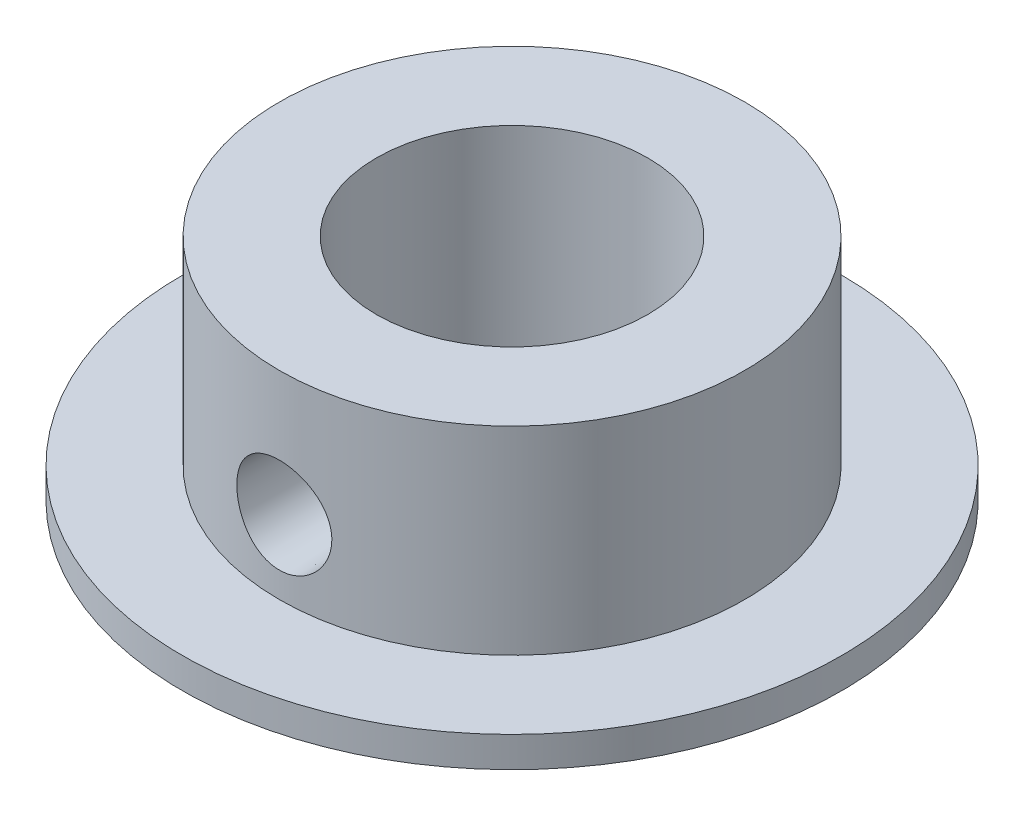
ISO-10303-21;
HEADER;
FILE_DESCRIPTION(('STEP AP214'),'2;1');
FILE_NAME('part.step','',(''),(''),'','','');
FILE_SCHEMA(('AUTOMOTIVE_DESIGN { 1 0 10303 214 1 1 1 1 }'));
ENDSEC;
DATA;
#1=APPLICATION_CONTEXT('core data for automotive mechanical design processes');
#2=APPLICATION_PROTOCOL_DEFINITION('international standard','automotive_design',2000,#1);
#3=PRODUCT_CONTEXT('',#1,'mechanical');
#4=PRODUCT('Part','Part','',(#3));
#5=PRODUCT_RELATED_PRODUCT_CATEGORY('part','',(#4));
#6=PRODUCT_DEFINITION_FORMATION('','',#4);
#7=PRODUCT_DEFINITION_CONTEXT('part definition',#1,'design');
#8=PRODUCT_DEFINITION('design','',#6,#7);
#9=PRODUCT_DEFINITION_SHAPE('','',#8);
#10=(LENGTH_UNIT() NAMED_UNIT(*) SI_UNIT(.MILLI.,.METRE.));
#11=(NAMED_UNIT(*) PLANE_ANGLE_UNIT() SI_UNIT($,.RADIAN.));
#12=(NAMED_UNIT(*) SI_UNIT($,.STERADIAN.) SOLID_ANGLE_UNIT());
#13=UNCERTAINTY_MEASURE_WITH_UNIT(LENGTH_MEASURE(1.E-05),#10,'distance_accuracy_value','');
#14=(GEOMETRIC_REPRESENTATION_CONTEXT(3) GLOBAL_UNCERTAINTY_ASSIGNED_CONTEXT((#13)) GLOBAL_UNIT_ASSIGNED_CONTEXT((#10,
#11,#12)) REPRESENTATION_CONTEXT('',''));
#15=CARTESIAN_POINT('',(0.,0.,0.));
#16=DIRECTION('',(0.,0.,1.));
#17=DIRECTION('',(1.,0.,0.));
#18=AXIS2_PLACEMENT_3D('',#15,#16,#17);
#19=CARTESIAN_POINT('',(-43.18,0.,0.));
#20=DIRECTION('',(0.,1.,0.));
#21=DIRECTION('',(0.,0.,1.));
#22=AXIS2_PLACEMENT_3D('',#19,#20,#21);
#23=PLANE('',#22);
#24=CARTESIAN_POINT('',(0.,0.,0.));
#25=DIRECTION('',(0.,-1.,0.));
#26=DIRECTION('',(0.,0.,-1.));
#27=AXIS2_PLACEMENT_3D('',#24,#25,#26);
#28=CIRCLE('',#27,17.78);
#29=CARTESIAN_POINT('',(0.,0.,-17.78));
#30=VERTEX_POINT('',#29);
#31=EDGE_CURVE('E49',#30,#30,#28,.T.);
#32=ORIENTED_EDGE('',*,*,#31,.F.);
#33=EDGE_LOOP('',(#32));
#34=FACE_BOUND('',#33,.T.);
#35=CARTESIAN_POINT('',(0.,0.,0.));
#36=DIRECTION('',(0.,-1.,0.));
#37=DIRECTION('',(0.,0.,-1.));
#38=AXIS2_PLACEMENT_3D('',#35,#36,#37);
#39=CIRCLE('',#38,43.18);
#40=CARTESIAN_POINT('',(0.,0.,-43.18));
#41=VERTEX_POINT('',#40);
#42=EDGE_CURVE('E68',#41,#41,#39,.T.);
#43=ORIENTED_EDGE('',*,*,#42,.T.);
#44=EDGE_LOOP('',(#43));
#45=FACE_BOUND('',#44,.T.);
#46=ADVANCED_FACE('F38',(#34,#45),#23,.F.);
#47=CARTESIAN_POINT('',(0.,0.,0.));
#48=DIRECTION('',(0.,-1.,0.));
#49=DIRECTION('',(0.,0.,-1.));
#50=AXIS2_PLACEMENT_3D('',#47,#48,#49);
#51=CYLINDRICAL_SURFACE('',#50,17.78);
#52=CARTESIAN_POINT('',(5.5626,13.5907211335726,16.8874474459582));
#53=CARTESIAN_POINT('',(5.56259799653194,13.8948516181382,16.887449279834));
#54=CARTESIAN_POINT('',(5.53757320653063,14.1990025148895,16.8957530810345));
#55=CARTESIAN_POINT('',(5.43842248054542,14.7983675438744,16.9279238130886));
#56=CARTESIAN_POINT('',(5.36428336511177,15.0935792551055,16.951794921282));
#57=CARTESIAN_POINT('',(5.16970366647505,15.6662973683474,17.0121376775781));
#58=CARTESIAN_POINT('',(5.04934515949177,15.9438341446535,17.0485869778099));
#59=CARTESIAN_POINT('',(4.76601718609229,16.4748533031106,17.1299481285032));
#60=CARTESIAN_POINT('',(4.60304015935641,16.7283314064844,17.1748614800512));
#61=CARTESIAN_POINT('',(4.23309199808434,17.2127655020356,17.2698245753533));
#62=CARTESIAN_POINT('',(4.02490617519083,17.4427712416914,17.3199909037924));
#63=CARTESIAN_POINT('',(3.57304914194704,17.8652416455484,17.4188155665127));
#64=CARTESIAN_POINT('',(3.32937297318863,18.0577010552927,17.4674736889262));
#65=CARTESIAN_POINT('',(2.80662170029229,18.4038108209972,17.5591333349199));
#66=CARTESIAN_POINT('',(2.52686923865835,18.5564822781229,17.6019815856354));
#67=CARTESIAN_POINT('',(1.94408899625521,18.8122367366045,17.6758320166248));
#68=CARTESIAN_POINT('',(1.641066718983,18.91533142163,17.7068369876287));
#69=CARTESIAN_POINT('',(1.03029836414449,19.0658322015901,17.7526822208269));
#70=CARTESIAN_POINT('',(0.722988466410091,19.1148624997284,17.7679929065144));
#71=CARTESIAN_POINT('',(0.104148158810804,19.1609891732897,17.7823860653401));
#72=CARTESIAN_POINT('',(-0.207381273357763,19.1580973804834,17.7814722356481));
#73=CARTESIAN_POINT('',(-0.814385038140694,19.1015297818226,17.7638467348304));
#74=CARTESIAN_POINT('',(-1.11004190701803,19.0496147463812,17.7476828195214));
#75=CARTESIAN_POINT('',(-1.68821414843808,18.8993638263056,17.7020472649873));
#76=CARTESIAN_POINT('',(-1.97072866194665,18.8010249119013,17.6725747572066));
#77=CARTESIAN_POINT('',(-2.51865568669428,18.559588100272,17.6028988935839));
#78=CARTESIAN_POINT('',(-2.78381616797672,18.4159564234788,17.5625684510842));
#79=CARTESIAN_POINT('',(-3.28681863173487,18.0884396778238,17.475425115714));
#80=CARTESIAN_POINT('',(-3.52465367063432,17.904544412059,17.4286105818287));
#81=CARTESIAN_POINT('',(-3.97675265174619,17.4926834744681,17.3311736146953));
#82=CARTESIAN_POINT('',(-4.18961727892208,17.2631979675597,17.2804738038556));
#83=CARTESIAN_POINT('',(-4.57425823479846,16.7713137594753,17.1826671732615));
#84=CARTESIAN_POINT('',(-4.74602970076193,16.5089111686689,17.135560779181));
#85=CARTESIAN_POINT('',(-5.04524152195174,15.9546797442947,17.0498836855244));
#86=CARTESIAN_POINT('',(-5.17216242207277,15.662553568771,17.0114147733903));
#87=CARTESIAN_POINT('',(-5.37457029510353,15.0595812987839,16.9485620949023));
#88=CARTESIAN_POINT('',(-5.45007579784475,14.7487419924369,16.9241732546493));
#89=CARTESIAN_POINT('',(-5.54480742208901,14.1305759767549,16.8933687285531));
#90=CARTESIAN_POINT('',(-5.56617677885104,13.8236115989619,16.8862690346161));
#91=CARTESIAN_POINT('',(-5.55804712196391,13.2104615595694,16.8889473614438));
#92=CARTESIAN_POINT('',(-5.52855599040939,12.9042757846705,16.8987227669933));
#93=CARTESIAN_POINT('',(-5.42145805901938,12.3106103574777,16.9333744324758));
#94=CARTESIAN_POINT('',(-5.34527160049011,12.022845726354,16.9578044883787));
#95=CARTESIAN_POINT('',(-5.14861388208657,11.4642166833903,17.0185397464918));
#96=CARTESIAN_POINT('',(-5.0281353885546,11.1933550405586,17.0548468883294));
#97=CARTESIAN_POINT('',(-4.74236365399869,10.6676083094957,17.1365403508849));
#98=CARTESIAN_POINT('',(-4.57588230062069,10.4134058246456,17.1821575534104));
#99=CARTESIAN_POINT('',(-4.20421700309147,9.93576513054903,17.2768536945692));
#100=CARTESIAN_POINT('',(-3.99902298217203,9.71233495747989,17.325933532427));
#101=CARTESIAN_POINT('',(-3.54561483414568,9.29300368254682,17.4244926641608));
#102=CARTESIAN_POINT('',(-3.29596739155893,9.09863228164299,17.4739038128939));
#103=CARTESIAN_POINT('',(-2.76640364247078,8.75448041968676,17.5655205183631));
#104=CARTESIAN_POINT('',(-2.48648871916527,8.60469792213575,17.607726404146));
#105=CARTESIAN_POINT('',(-1.90605469683529,8.3554115877011,17.67993671454));
#106=CARTESIAN_POINT('',(-1.60570323086148,8.25554421322612,17.7100290411099));
#107=CARTESIAN_POINT('',(-0.991359762528713,8.10807300016658,17.7550081633762));
#108=CARTESIAN_POINT('',(-0.677372071624576,8.06045276553649,17.7698997292292));
#109=CARTESIAN_POINT('',(-0.0587487764184504,8.02016193405157,17.7824826718043));
#110=CARTESIAN_POINT('',(0.245730566899102,8.02528197792518,17.780865641322));
#111=CARTESIAN_POINT('',(0.849294856623028,8.0849817447503,17.7622703954053));
#112=CARTESIAN_POINT('',(1.14838015480263,8.1395582304122,17.7452931854082));
#113=CARTESIAN_POINT('',(1.72897426833904,8.295213854852,17.6981045443233));
#114=CARTESIAN_POINT('',(2.01065666127446,8.39570031667859,17.6680620115536));
#115=CARTESIAN_POINT('',(2.55329892254731,8.63978785619013,17.5978409184935));
#116=CARTESIAN_POINT('',(2.81425522292724,8.78339633699422,17.5576606179567));
#117=CARTESIAN_POINT('',(3.31768437705666,9.11529346149104,17.4696571970187));
#118=CARTESIAN_POINT('',(3.55922813032537,9.30493425316835,17.4216208050681));
#119=CARTESIAN_POINT('',(4.00779737055767,9.7211294125474,17.3239361070312));
#120=CARTESIAN_POINT('',(4.21481248049181,9.94769483705322,17.2742873217026));
#121=CARTESIAN_POINT('',(4.59539039242137,10.4403313330796,17.1770402529991));
#122=CARTESIAN_POINT('',(4.76761301971548,10.7074649763758,17.129564927276));
#123=CARTESIAN_POINT('',(5.06453421944384,11.2683115528947,17.0441454442059));
#124=CARTESIAN_POINT('',(5.18925190485222,11.5620137376398,17.006197455762));
#125=CARTESIAN_POINT('',(5.37858260309395,12.1421205671121,16.9472198273331));
#126=CARTESIAN_POINT('',(5.4473860542798,12.4270424578128,16.9250309773609));
#127=CARTESIAN_POINT('',(5.53939006705727,13.0048782972278,16.8951456992054));
#128=CARTESIAN_POINT('',(5.5626019296904,13.2977902471454,16.8874456796148));
#129=CARTESIAN_POINT('',(5.5626,13.5907211335726,16.8874474459582));
#130=B_SPLINE_CURVE_WITH_KNOTS('',3,(#52,#53,#54,#55,#56,#57,#58,#59,#60,#61,#62,#63,#64,#65,
#66,#67,#68,#69,#70,#71,#72,#73,#74,#75,#76,#77,#78,#79,#80,#81,#82,#83,#84,#85,#86,#87,#88,#89,
#90,#91,#92,#93,#94,#95,#96,#97,#98,#99,#100,#101,#102,#103,#104,#105,#106,#107,#108,#109,#110,
#111,#112,#113,#114,#115,#116,#117,#118,#119,#120,#121,#122,#123,#124,#125,#126,#127,#128,#129),
.UNSPECIFIED.,.T.,.F.,(4,2,2,2,2,2,2,2,2,2,2,2,2,2,2,2,2,2,2,2,2,2,2,2,2,2,2,2,2,2,2,2,2,2,2,2,
2,2,4),(0.,0.911309336315475,1.82286331456051,2.732805988797,3.64291019210341,4.58142903624863,
5.5200791282382,6.48001211295374,7.43971876097127,8.36973424418313,9.29953780237007,
10.1971668451653,11.0948544781912,12.003543851136,12.9124636197677,13.8593446088505,
14.8063375912204,15.7639644034392,16.7212459092102,17.6399908505404,18.5585934223401,
19.4505531110074,20.3426585369258,21.260394838288,22.178370353521,23.1344904924302,
24.0905669559846,25.0395748671134,25.9882848780804,26.8974194311162,27.8064944788751,
28.7041516581378,29.6019630339425,30.5302751554279,31.458865765478,32.4183126864641,
33.377373178118,34.2553412232837,35.1330916141319),.UNSPECIFIED.);
#131=CARTESIAN_POINT('',(5.5626,13.5907211335726,16.8874474459582));
#132=VERTEX_POINT('',#131);
#133=EDGE_CURVE('E71',#132,#132,#130,.T.);
#134=ORIENTED_EDGE('',*,*,#133,.T.);
#135=EDGE_LOOP('',(#134));
#136=FACE_BOUND('',#135,.T.);
#137=CARTESIAN_POINT('',(0.,30.,0.));
#138=DIRECTION('',(0.,-1.,0.));
#139=DIRECTION('',(0.,0.,-1.));
#140=AXIS2_PLACEMENT_3D('',#137,#138,#139);
#141=CIRCLE('',#140,17.78);
#142=CARTESIAN_POINT('',(0.,30.,-17.78));
#143=VERTEX_POINT('',#142);
#144=EDGE_CURVE('E53',#143,#143,#141,.T.);
#145=ORIENTED_EDGE('',*,*,#144,.F.);
#146=EDGE_LOOP('',(#145));
#147=FACE_BOUND('',#146,.T.);
#148=ORIENTED_EDGE('',*,*,#31,.T.);
#149=EDGE_LOOP('',(#148));
#150=FACE_BOUND('',#149,.T.);
#151=ADVANCED_FACE('F104',(#136,#147,#150),#51,.F.);
#152=CARTESIAN_POINT('',(-17.78,30.,0.));
#153=DIRECTION('',(0.,-1.,0.));
#154=DIRECTION('',(0.,0.,-1.));
#155=AXIS2_PLACEMENT_3D('',#152,#153,#154);
#156=PLANE('',#155);
#157=CARTESIAN_POINT('',(0.,30.,0.));
#158=DIRECTION('',(0.,-1.,0.));
#159=DIRECTION('',(0.,0.,-1.));
#160=AXIS2_PLACEMENT_3D('',#157,#158,#159);
#161=CIRCLE('',#160,30.48);
#162=CARTESIAN_POINT('',(0.,30.,-30.48));
#163=VERTEX_POINT('',#162);
#164=EDGE_CURVE('E57',#163,#163,#161,.T.);
#165=ORIENTED_EDGE('',*,*,#164,.F.);
#166=EDGE_LOOP('',(#165));
#167=FACE_BOUND('',#166,.T.);
#168=ORIENTED_EDGE('',*,*,#144,.T.);
#169=EDGE_LOOP('',(#168));
#170=FACE_BOUND('',#169,.T.);
#171=ADVANCED_FACE('F109',(#167,#170),#156,.F.);
#172=CARTESIAN_POINT('',(0.,0.,0.));
#173=DIRECTION('',(0.,-1.,0.));
#174=DIRECTION('',(0.,0.,-1.));
#175=AXIS2_PLACEMENT_3D('',#172,#173,#174);
#176=CYLINDRICAL_SURFACE('',#175,30.48);
#177=CARTESIAN_POINT('',(-4.48000392389874,9.25603133846592,30.1489629148641));
#178=CARTESIAN_POINT('',(-4.72247113458441,9.50819389164376,30.1129338951547));
#179=CARTESIAN_POINT('',(-4.94379996884934,9.7809284912397,30.0770512021185));
#180=CARTESIAN_POINT('',(-5.33798949704485,10.3601304241621,30.0096062659273));
#181=CARTESIAN_POINT('',(-5.51081356925483,10.6666230033997,29.9780472963912));
#182=CARTESIAN_POINT('',(-5.8029464422564,11.3049767160678,29.9228745201749));
#183=CARTESIAN_POINT('',(-5.92223706797604,11.6368464205648,29.8992634125419));
#184=CARTESIAN_POINT('',(-6.10351454748918,12.3163826272242,29.8627889130605));
#185=CARTESIAN_POINT('',(-6.16551682605666,12.6640448508169,29.8499226282795));
#186=CARTESIAN_POINT('',(-6.22987573987205,13.3606862179332,29.8365569372631));
#187=CARTESIAN_POINT('',(-6.23296915148332,13.7095944236912,29.8359047701124));
#188=CARTESIAN_POINT('',(-6.18129381404148,14.4029061179806,29.8466527741398));
#189=CARTESIAN_POINT('',(-6.12652530003199,14.747309624805,29.8580528963597));
#190=CARTESIAN_POINT('',(-5.96145141776871,15.4193505357793,29.8914443447242));
#191=CARTESIAN_POINT('',(-5.85154537458516,15.7470900923186,29.9133594685269));
#192=CARTESIAN_POINT('',(-5.57965574578697,16.3795147213721,29.9652614327979));
#193=CARTESIAN_POINT('',(-5.41766754313323,16.684197746985,29.995248988842));
#194=CARTESIAN_POINT('',(-5.04353875024559,17.2664588939525,30.0604315611117));
#195=CARTESIAN_POINT('',(-4.83073487386508,17.5436033630238,30.0956929242731));
#196=CARTESIAN_POINT('',(-4.36198325557281,18.0585073960779,30.1671939416486));
#197=CARTESIAN_POINT('',(-4.10603181949941,18.2962635842981,30.2034336794049));
#198=CARTESIAN_POINT('',(-3.55451236143887,18.7284251881168,30.2733194586524));
#199=CARTESIAN_POINT('',(-3.25851282784303,18.9222864339178,30.3069298819289));
#200=CARTESIAN_POINT('',(-2.63740171350416,19.257298046809,30.367280387175));
#201=CARTESIAN_POINT('',(-2.31229239989166,19.3984525143939,30.394021003553));
#202=CARTESIAN_POINT('',(-1.64594515478295,19.6223632112039,30.4373358060864));
#203=CARTESIAN_POINT('',(-1.30492780648902,19.7057538134953,30.4540201588241));
#204=CARTESIAN_POINT('',(-0.613373739581415,19.813926528134,30.4757896161221));
#205=CARTESIAN_POINT('',(-0.262838308505033,19.8387165279887,30.4808762817014));
#206=CARTESIAN_POINT('',(0.430541652697676,19.8289710864849,30.4788933984586));
#207=CARTESIAN_POINT('',(0.773403507375742,19.7955767486483,30.4720576674102));
#208=CARTESIAN_POINT('',(1.44851341164854,19.672743525369,30.4474358072788));
#209=CARTESIAN_POINT('',(1.78076146476839,19.5833046585403,30.4296496818327));
#210=CARTESIAN_POINT('',(2.42544476915547,19.3511704394965,30.3850642378461));
#211=CARTESIAN_POINT('',(2.73787865234378,19.2084714145814,30.3582642977458));
#212=CARTESIAN_POINT('',(3.33463025710079,18.8740056233484,30.2985262174026));
#213=CARTESIAN_POINT('',(3.61894471227846,18.6822331658539,30.265587365334));
#214=CARTESIAN_POINT('',(4.15728640221199,18.250755982749,30.196399542017));
#215=CARTESIAN_POINT('',(4.41062218110615,18.0101966076357,30.160098905075));
#216=CARTESIAN_POINT('',(4.87375697978455,17.4901119760468,30.0887343090442));
#217=CARTESIAN_POINT('',(5.0835524276711,17.2105835258258,30.0536704516121));
#218=CARTESIAN_POINT('',(5.45605423907557,16.6165758431748,29.9883006951489));
#219=CARTESIAN_POINT('',(5.61818169118517,16.3017263609734,29.9580551836878));
#220=CARTESIAN_POINT('',(5.88722071244882,15.6485843949176,29.906352570051));
#221=CARTESIAN_POINT('',(5.99413730666365,15.3102940477322,29.8848946681008));
#222=CARTESIAN_POINT('',(6.1485446516712,14.6239142506757,29.8535090113337));
#223=CARTESIAN_POINT('',(6.19669365375662,14.275978846755,29.8434536299746));
#224=CARTESIAN_POINT('',(6.23421445475274,13.5768315880009,29.835639221645));
#225=CARTESIAN_POINT('',(6.22359161943182,13.2256200351969,29.8378790721407));
#226=CARTESIAN_POINT('',(6.14448949127621,12.5350707574578,29.8542659035522));
#227=CARTESIAN_POINT('',(6.07682102613925,12.195635680222,29.8682460018458));
#228=CARTESIAN_POINT('',(5.8867814671738,11.53304278612,29.9062788024832));
#229=CARTESIAN_POINT('',(5.7644075772491,11.2098858021969,29.9303320196791));
#230=CARTESIAN_POINT('',(5.46749246075758,10.5864342092598,29.9859931434248));
#231=CARTESIAN_POINT('',(5.29259278940083,10.2863150752651,30.0176526497225));
#232=CARTESIAN_POINT('',(4.895798142843,9.71942145465693,30.0849121062518));
#233=CARTESIAN_POINT('',(4.6738978992107,9.45265071149706,30.1205124980151));
#234=CARTESIAN_POINT('',(4.18501535116696,8.95549562227931,30.1923490452789));
#235=CARTESIAN_POINT('',(3.91735646828385,8.72577608389435,30.2285860953747));
#236=CARTESIAN_POINT('',(3.34678416336345,8.31455162790204,30.2970602119394));
#237=CARTESIAN_POINT('',(3.04387101091598,8.13304634163454,30.329297308992));
#238=CARTESIAN_POINT('',(2.41174433929228,7.8239595737782,30.3860867550792));
#239=CARTESIAN_POINT('',(2.08258526196357,7.69626975386348,30.4106545174741));
#240=CARTESIAN_POINT('',(1.40685270762256,7.49836042694195,30.4493933195704));
#241=CARTESIAN_POINT('',(1.06028212579423,7.42813139870816,30.4635660816783));
#242=CARTESIAN_POINT('',(0.366974955951805,7.34826894521899,30.4797238323853));
#243=CARTESIAN_POINT('',(0.0203796579581413,7.33745441458697,30.4819463613483));
#244=CARTESIAN_POINT('',(-0.669695335572751,7.37360784430016,30.4745954463156));
#245=CARTESIAN_POINT('',(-1.01317476008908,7.42058078340378,30.465020985934));
#246=CARTESIAN_POINT('',(-1.68398129784924,7.57007414703985,30.4352824318542));
#247=CARTESIAN_POINT('',(-2.01142741060248,7.67208259193135,30.4152159943364));
#248=CARTESIAN_POINT('',(-2.64443226382704,7.92814961722128,30.3667268076955));
#249=CARTESIAN_POINT('',(-2.95000457014328,8.08217559207236,30.3383092946258));
#250=CARTESIAN_POINT('',(-3.46753149729627,8.39869910969331,30.2829807819778));
#251=CARTESIAN_POINT('',(-3.6853262553205,8.55194172374274,30.2571045772332));
#252=CARTESIAN_POINT('',(-4.09948089055007,8.88484319076197,30.2037784607935));
#253=CARTESIAN_POINT('',(-4.29583981961534,9.06450321139056,30.1763284795696));
#254=CARTESIAN_POINT('',(-4.48000392389874,9.25603133846592,30.1489629148641));
#255=B_SPLINE_CURVE_WITH_KNOTS('',3,(#177,#178,#179,#180,#181,#182,#183,#184,#185,#186,#187,
#188,#189,#190,#191,#192,#193,#194,#195,#196,#197,#198,#199,#200,#201,#202,#203,#204,#205,#206,
#207,#208,#209,#210,#211,#212,#213,#214,#215,#216,#217,#218,#219,#220,#221,#222,#223,#224,#225,
#226,#227,#228,#229,#230,#231,#232,#233,#234,#235,#236,#237,#238,#239,#240,#241,#242,#243,#244,
#245,#246,#247,#248,#249,#250,#251,#252,#253,#254),.UNSPECIFIED.,.T.,.F.,(4,2,2,2,2,2,2,2,2,2,2,
2,2,2,2,2,2,2,2,2,2,2,2,2,2,2,2,2,2,2,2,2,2,2,2,2,2,2,4),(0.,1.05407028627067,2.10893428132168,
3.16415614145515,4.21909380233034,5.26082851419077,6.3025589943887,7.33685152165849,
8.37123576337228,9.41994053148602,10.4687351321271,11.5298953446634,12.590972983591,
13.6402045999203,14.6892949840225,15.7180416440015,16.7467879623047,17.7756052337346,
18.8045418739604,19.8533621288059,20.9022683912443,21.9634317316073,23.0244984723021,
24.0735678731787,25.1225414973912,26.1568519442153,27.1912152626197,28.2328041539517,
29.2745098618674,30.3332145739726,31.3919111906819,32.4484661977992,33.5048460987579,
34.5401480324281,35.5755391701982,36.6014603804366,37.62673971422,38.4273152935534,
39.2279262692554),.UNSPECIFIED.);
#256=CARTESIAN_POINT('',(-4.48000392389874,9.25603133846592,30.1489629148641));
#257=VERTEX_POINT('',#256);
#258=EDGE_CURVE('E10',#257,#257,#255,.T.);
#259=ORIENTED_EDGE('',*,*,#258,.T.);
#260=EDGE_LOOP('',(#259));
#261=FACE_BOUND('',#260,.T.);
#262=CARTESIAN_POINT('',(0.,4.,0.));
#263=DIRECTION('',(0.,-1.,0.));
#264=DIRECTION('',(0.,0.,-1.));
#265=AXIS2_PLACEMENT_3D('',#262,#263,#264);
#266=CIRCLE('',#265,30.48);
#267=CARTESIAN_POINT('',(0.,4.,-30.48));
#268=VERTEX_POINT('',#267);
#269=EDGE_CURVE('E62',#268,#268,#266,.T.);
#270=ORIENTED_EDGE('',*,*,#269,.F.);
#271=EDGE_LOOP('',(#270));
#272=FACE_BOUND('',#271,.T.);
#273=ORIENTED_EDGE('',*,*,#164,.T.);
#274=EDGE_LOOP('',(#273));
#275=FACE_BOUND('',#274,.T.);
#276=ADVANCED_FACE('F118',(#261,#272,#275),#176,.T.);
#277=CARTESIAN_POINT('',(-30.48,4.,0.));
#278=DIRECTION('',(0.,-1.,0.));
#279=DIRECTION('',(0.,0.,-1.));
#280=AXIS2_PLACEMENT_3D('',#277,#278,#279);
#281=PLANE('',#280);
#282=CARTESIAN_POINT('',(0.,4.,0.));
#283=DIRECTION('',(0.,-1.,0.));
#284=DIRECTION('',(0.,0.,-1.));
#285=AXIS2_PLACEMENT_3D('',#282,#283,#284);
#286=CIRCLE('',#285,43.18);
#287=CARTESIAN_POINT('',(0.,4.,-43.18));
#288=VERTEX_POINT('',#287);
#289=EDGE_CURVE('E65',#288,#288,#286,.T.);
#290=ORIENTED_EDGE('',*,*,#289,.F.);
#291=EDGE_LOOP('',(#290));
#292=FACE_BOUND('',#291,.T.);
#293=ORIENTED_EDGE('',*,*,#269,.T.);
#294=EDGE_LOOP('',(#293));
#295=FACE_BOUND('',#294,.T.);
#296=ADVANCED_FACE('F99',(#292,#295),#281,.F.);
#297=CARTESIAN_POINT('',(0.,0.,0.));
#298=DIRECTION('',(0.,-1.,0.));
#299=DIRECTION('',(0.,0.,-1.));
#300=AXIS2_PLACEMENT_3D('',#297,#298,#299);
#301=CYLINDRICAL_SURFACE('',#300,43.18);
#302=ORIENTED_EDGE('',*,*,#42,.F.);
#303=EDGE_LOOP('',(#302));
#304=FACE_BOUND('',#303,.T.);
#305=ORIENTED_EDGE('',*,*,#289,.T.);
#306=EDGE_LOOP('',(#305));
#307=FACE_BOUND('',#306,.T.);
#308=ADVANCED_FACE('F94',(#304,#307),#301,.T.);
#309=CARTESIAN_POINT('',(0.,13.5907211335726,30.48));
#310=DIRECTION('',(0.,0.,1.));
#311=DIRECTION('',(1.,0.,0.));
#312=AXIS2_PLACEMENT_3D('',#309,#310,#311);
#313=CONICAL_SURFACE('',#312,6.2436883,0.0299323966717029);
#314=CARTESIAN_POINT('',(0.,13.5907211335726,20.46));
#315=DIRECTION('',(0.,0.,1.));
#316=DIRECTION('',(1.,0.,0.));
#317=AXIS2_PLACEMENT_3D('',#314,#315,#316);
#318=CIRCLE('',#317,5.94367608151128);
#319=CARTESIAN_POINT('',(5.94367608151128,13.5907211335726,20.46));
#320=VERTEX_POINT('',#319);
#321=EDGE_CURVE('E194',#320,#320,#318,.T.);
#322=ORIENTED_EDGE('',*,*,#321,.F.);
#323=EDGE_LOOP('',(#322));
#324=FACE_BOUND('',#323,.T.);
#325=ORIENTED_EDGE('',*,*,#258,.F.);
#326=EDGE_LOOP('',(#325));
#327=FACE_BOUND('',#326,.T.);
#328=ADVANCED_FACE('F88',(#324,#327),#313,.F.);
#329=CARTESIAN_POINT('',(0.,13.5907211335726,30.48));
#330=DIRECTION('',(0.,0.,1.));
#331=DIRECTION('',(1.,0.,0.));
#332=AXIS2_PLACEMENT_3D('',#329,#330,#331);
#333=CYLINDRICAL_SURFACE('',#332,5.5626);
#334=ORIENTED_EDGE('',*,*,#133,.F.);
#335=EDGE_LOOP('',(#334));
#336=FACE_BOUND('',#335,.T.);
#337=CARTESIAN_POINT('',(0.,13.5907211335726,20.46));
#338=DIRECTION('',(0.,0.,1.));
#339=DIRECTION('',(1.,0.,0.));
#340=AXIS2_PLACEMENT_3D('',#337,#338,#339);
#341=CIRCLE('',#340,5.5626);
#342=CARTESIAN_POINT('',(5.5626,13.5907211335726,20.46));
#343=VERTEX_POINT('',#342);
#344=EDGE_CURVE('E79',#343,#343,#341,.T.);
#345=ORIENTED_EDGE('',*,*,#344,.T.);
#346=EDGE_LOOP('',(#345));
#347=FACE_BOUND('',#346,.T.);
#348=ADVANCED_FACE('F83',(#336,#347),#333,.F.);
#349=CARTESIAN_POINT('',(5.5626,13.5907211335726,20.46));
#350=DIRECTION('',(0.,0.,-1.));
#351=DIRECTION('',(-1.,0.,0.));
#352=AXIS2_PLACEMENT_3D('',#349,#350,#351);
#353=PLANE('',#352);
#354=ORIENTED_EDGE('',*,*,#344,.F.);
#355=EDGE_LOOP('',(#354));
#356=FACE_BOUND('',#355,.T.);
#357=ORIENTED_EDGE('',*,*,#321,.T.);
#358=EDGE_LOOP('',(#357));
#359=FACE_BOUND('',#358,.T.);
#360=ADVANCED_FACE('F87',(#356,#359),#353,.F.);
#361=CLOSED_SHELL('',(#46,#151,#171,#276,#296,#308,#328,#348,#360));
#362=MANIFOLD_SOLID_BREP('B2',#361);
#363=ADVANCED_BREP_SHAPE_REPRESENTATION('',(#18,#362),#14);
#364=SHAPE_DEFINITION_REPRESENTATION(#9,#363);
ENDSEC;
END-ISO-10303-21;
